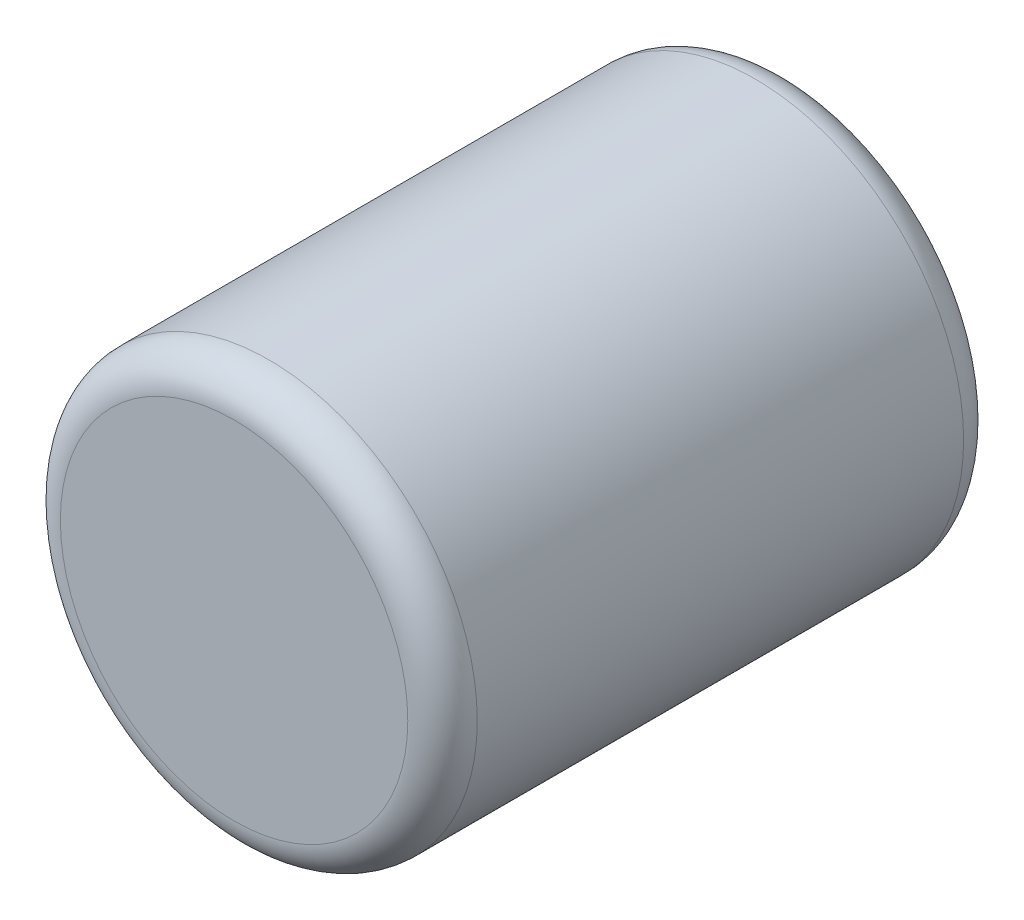
ISO-10303-21;
HEADER;
FILE_DESCRIPTION(('STEP AP214'),'2;1');
FILE_NAME('part.step','',(''),(''),'','','');
FILE_SCHEMA(('AUTOMOTIVE_DESIGN { 1 0 10303 214 1 1 1 1 }'));
ENDSEC;
DATA;
#1=APPLICATION_CONTEXT('core data for automotive mechanical design processes');
#2=APPLICATION_PROTOCOL_DEFINITION('international standard','automotive_design',2000,#1);
#3=PRODUCT_CONTEXT('',#1,'mechanical');
#4=PRODUCT('Part','Part','',(#3));
#5=PRODUCT_RELATED_PRODUCT_CATEGORY('part','',(#4));
#6=PRODUCT_DEFINITION_FORMATION('','',#4);
#7=PRODUCT_DEFINITION_CONTEXT('part definition',#1,'design');
#8=PRODUCT_DEFINITION('design','',#6,#7);
#9=PRODUCT_DEFINITION_SHAPE('','',#8);
#10=(LENGTH_UNIT() NAMED_UNIT(*) SI_UNIT(.MILLI.,.METRE.));
#11=(NAMED_UNIT(*) PLANE_ANGLE_UNIT() SI_UNIT($,.RADIAN.));
#12=(NAMED_UNIT(*) SI_UNIT($,.STERADIAN.) SOLID_ANGLE_UNIT());
#13=UNCERTAINTY_MEASURE_WITH_UNIT(LENGTH_MEASURE(1.E-05),#10,'distance_accuracy_value','');
#14=(GEOMETRIC_REPRESENTATION_CONTEXT(3) GLOBAL_UNCERTAINTY_ASSIGNED_CONTEXT((#13)) GLOBAL_UNIT_ASSIGNED_CONTEXT((#10,
#11,#12)) REPRESENTATION_CONTEXT('',''));
#15=CARTESIAN_POINT('',(0.,0.,0.));
#16=DIRECTION('',(0.,0.,1.));
#17=DIRECTION('',(1.,0.,0.));
#18=AXIS2_PLACEMENT_3D('',#15,#16,#17);
#19=CARTESIAN_POINT('',(0.,0.,0.5));
#20=DIRECTION('',(0.,0.,1.));
#21=DIRECTION('',(1.,0.,0.));
#22=AXIS2_PLACEMENT_3D('',#19,#20,#21);
#23=TOROIDAL_SURFACE('',#22,2.5,0.5);
#24=CARTESIAN_POINT('',(0.,0.,0.));
#25=DIRECTION('',(0.,0.,1.));
#26=DIRECTION('',(1.,0.,0.));
#27=AXIS2_PLACEMENT_3D('',#24,#25,#26);
#28=CIRCLE('',#27,2.5);
#29=CARTESIAN_POINT('',(2.5,0.,0.));
#30=VERTEX_POINT('',#29);
#31=EDGE_CURVE('E10',#30,#30,#28,.T.);
#32=ORIENTED_EDGE('',*,*,#31,.T.);
#33=EDGE_LOOP('',(#32));
#34=FACE_BOUND('',#33,.T.);
#35=CARTESIAN_POINT('',(0.,0.,0.5));
#36=DIRECTION('',(0.,0.,1.));
#37=DIRECTION('',(1.,0.,0.));
#38=AXIS2_PLACEMENT_3D('',#35,#36,#37);
#39=CIRCLE('',#38,3.);
#40=CARTESIAN_POINT('',(3.,0.,0.5));
#41=VERTEX_POINT('',#40);
#42=EDGE_CURVE('E48',#41,#41,#39,.T.);
#43=ORIENTED_EDGE('',*,*,#42,.F.);
#44=EDGE_LOOP('',(#43));
#45=FACE_BOUND('',#44,.T.);
#46=ADVANCED_FACE('F34',(#34,#45),#23,.T.);
#47=CARTESIAN_POINT('',(2.5,0.,0.));
#48=DIRECTION('',(0.,0.,-1.));
#49=DIRECTION('',(-1.,0.,0.));
#50=AXIS2_PLACEMENT_3D('',#47,#48,#49);
#51=PLANE('',#50);
#52=ORIENTED_EDGE('',*,*,#31,.F.);
#53=EDGE_LOOP('',(#52));
#54=FACE_BOUND('',#53,.T.);
#55=ADVANCED_FACE('F58',(#54),#51,.T.);
#56=CARTESIAN_POINT('',(0.,0.,8.));
#57=DIRECTION('',(0.,0.,1.));
#58=DIRECTION('',(1.,0.,0.));
#59=AXIS2_PLACEMENT_3D('',#56,#57,#58);
#60=PLANE('',#59);
#61=CARTESIAN_POINT('',(0.,0.,8.));
#62=DIRECTION('',(0.,0.,1.));
#63=DIRECTION('',(1.,0.,0.));
#64=AXIS2_PLACEMENT_3D('',#61,#62,#63);
#65=CIRCLE('',#64,2.5);
#66=CARTESIAN_POINT('',(2.5,0.,8.));
#67=VERTEX_POINT('',#66);
#68=EDGE_CURVE('E40',#67,#67,#65,.T.);
#69=ORIENTED_EDGE('',*,*,#68,.T.);
#70=EDGE_LOOP('',(#69));
#71=FACE_BOUND('',#70,.T.);
#72=ADVANCED_FACE('F62',(#71),#60,.T.);
#73=CARTESIAN_POINT('',(0.,0.,7.5));
#74=DIRECTION('',(0.,0.,1.));
#75=DIRECTION('',(1.,0.,0.));
#76=AXIS2_PLACEMENT_3D('',#73,#74,#75);
#77=TOROIDAL_SURFACE('',#76,2.5,0.5);
#78=CARTESIAN_POINT('',(0.,0.,7.5));
#79=DIRECTION('',(0.,0.,1.));
#80=DIRECTION('',(1.,0.,0.));
#81=AXIS2_PLACEMENT_3D('',#78,#79,#80);
#82=CIRCLE('',#81,3.);
#83=CARTESIAN_POINT('',(3.,0.,7.5));
#84=VERTEX_POINT('',#83);
#85=EDGE_CURVE('E44',#84,#84,#82,.T.);
#86=ORIENTED_EDGE('',*,*,#85,.T.);
#87=EDGE_LOOP('',(#86));
#88=FACE_BOUND('',#87,.T.);
#89=ORIENTED_EDGE('',*,*,#68,.F.);
#90=EDGE_LOOP('',(#89));
#91=FACE_BOUND('',#90,.T.);
#92=ADVANCED_FACE('F67',(#88,#91),#77,.T.);
#93=CARTESIAN_POINT('',(0.,0.,-0.00273815177070404));
#94=DIRECTION('',(0.,0.,1.));
#95=DIRECTION('',(1.,0.,0.));
#96=AXIS2_PLACEMENT_3D('',#93,#94,#95);
#97=CYLINDRICAL_SURFACE('',#96,3.);
#98=ORIENTED_EDGE('',*,*,#42,.T.);
#99=EDGE_LOOP('',(#98));
#100=FACE_BOUND('',#99,.T.);
#101=ORIENTED_EDGE('',*,*,#85,.F.);
#102=EDGE_LOOP('',(#101));
#103=FACE_BOUND('',#102,.T.);
#104=ADVANCED_FACE('F54',(#100,#103),#97,.T.);
#105=CLOSED_SHELL('',(#46,#55,#72,#92,#104));
#106=MANIFOLD_SOLID_BREP('B2',#105);
#107=ADVANCED_BREP_SHAPE_REPRESENTATION('',(#18,#106),#14);
#108=SHAPE_DEFINITION_REPRESENTATION(#9,#107);
ENDSEC;
END-ISO-10303-21;
